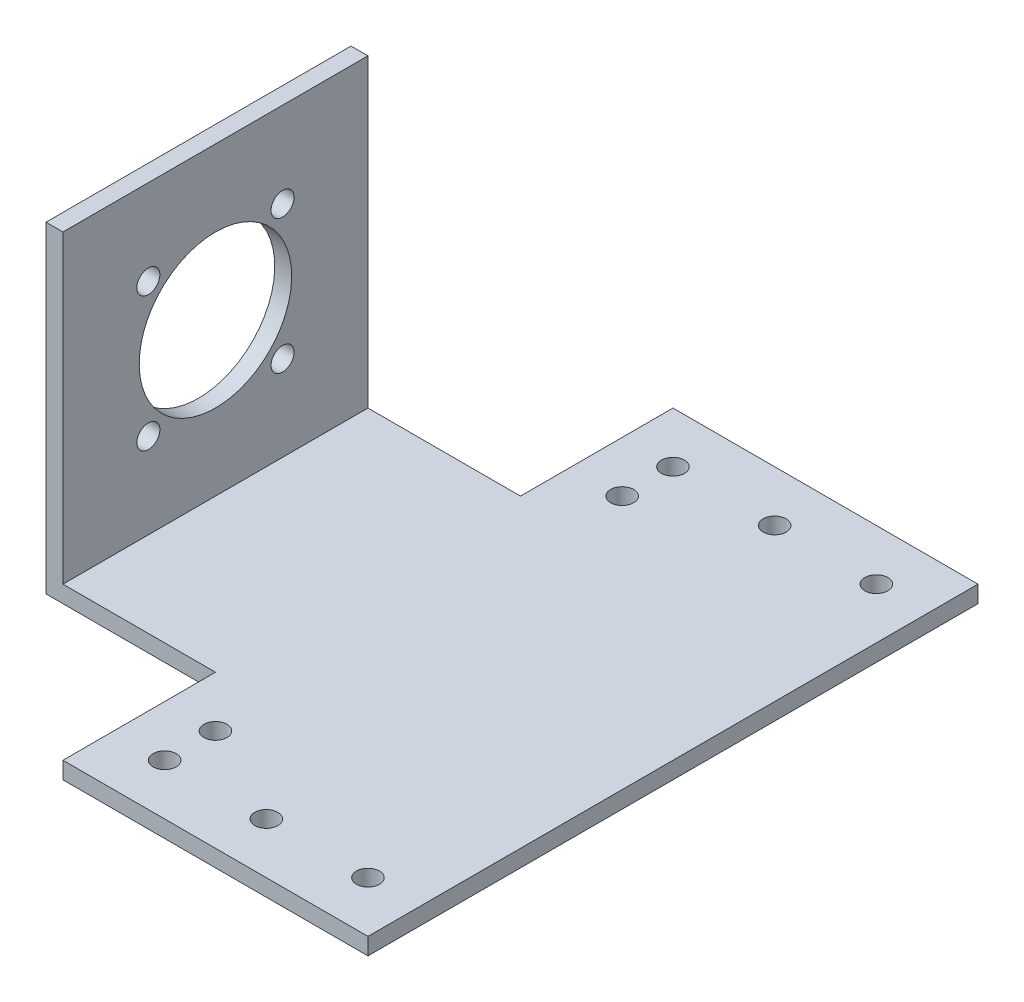
ISO-10303-21;
HEADER;
FILE_DESCRIPTION(('STEP AP214'),'2;1');
FILE_NAME('part.step','',(''),(''),'','','');
FILE_SCHEMA(('AUTOMOTIVE_DESIGN { 1 0 10303 214 1 1 1 1 }'));
ENDSEC;
DATA;
#1=APPLICATION_CONTEXT('core data for automotive mechanical design processes');
#2=APPLICATION_PROTOCOL_DEFINITION('international standard','automotive_design',2000,#1);
#3=PRODUCT_CONTEXT('',#1,'mechanical');
#4=PRODUCT('Part','Part','',(#3));
#5=PRODUCT_RELATED_PRODUCT_CATEGORY('part','',(#4));
#6=PRODUCT_DEFINITION_FORMATION('','',#4);
#7=PRODUCT_DEFINITION_CONTEXT('part definition',#1,'design');
#8=PRODUCT_DEFINITION('design','',#6,#7);
#9=PRODUCT_DEFINITION_SHAPE('','',#8);
#10=(LENGTH_UNIT() NAMED_UNIT(*) SI_UNIT(.MILLI.,.METRE.));
#11=(NAMED_UNIT(*) PLANE_ANGLE_UNIT() SI_UNIT($,.RADIAN.));
#12=(NAMED_UNIT(*) SI_UNIT($,.STERADIAN.) SOLID_ANGLE_UNIT());
#13=UNCERTAINTY_MEASURE_WITH_UNIT(LENGTH_MEASURE(1.E-05),#10,'distance_accuracy_value','');
#14=(GEOMETRIC_REPRESENTATION_CONTEXT(3) GLOBAL_UNCERTAINTY_ASSIGNED_CONTEXT((#13)) GLOBAL_UNIT_ASSIGNED_CONTEXT((#10,
#11,#12)) REPRESENTATION_CONTEXT('',''));
#15=CARTESIAN_POINT('',(0.,0.,0.));
#16=DIRECTION('',(0.,0.,1.));
#17=DIRECTION('',(1.,0.,0.));
#18=AXIS2_PLACEMENT_3D('',#15,#16,#17);
#19=CARTESIAN_POINT('',(0.,2.49999999999999,45.));
#20=DIRECTION('',(1.,0.,0.));
#21=DIRECTION('',(0.,1.,0.));
#22=AXIS2_PLACEMENT_3D('',#19,#20,#21);
#23=PLANE('',#22);
#24=DIRECTION('',(0.,1.,0.));
#25=VECTOR('',#24,1.);
#26=CARTESIAN_POINT('',(0.,2.49999999999999,22.5));
#27=LINE('',#26,#25);
#28=CARTESIAN_POINT('',(0.,0.,22.5));
#29=VERTEX_POINT('',#28);
#30=CARTESIAN_POINT('',(0.,2.49999999999999,22.5));
#31=VERTEX_POINT('',#30);
#32=EDGE_CURVE('E114',#29,#31,#27,.T.);
#33=ORIENTED_EDGE('',*,*,#32,.F.);
#34=DIRECTION('',(0.,0.,-1.));
#35=VECTOR('',#34,1.);
#36=CARTESIAN_POINT('',(0.,0.,45.));
#37=LINE('',#36,#35);
#38=CARTESIAN_POINT('',(0.,0.,45.));
#39=VERTEX_POINT('',#38);
#40=EDGE_CURVE('E11',#39,#29,#37,.T.);
#41=ORIENTED_EDGE('',*,*,#40,.F.);
#42=DIRECTION('',(0.,-1.,0.));
#43=VECTOR('',#42,1.);
#44=CARTESIAN_POINT('',(0.,2.49999999999999,45.));
#45=LINE('',#44,#43);
#46=CARTESIAN_POINT('',(0.,2.49999999999999,45.));
#47=VERTEX_POINT('',#46);
#48=EDGE_CURVE('E116',#47,#39,#45,.T.);
#49=ORIENTED_EDGE('',*,*,#48,.F.);
#50=DIRECTION('',(0.,0.,-1.));
#51=VECTOR('',#50,1.);
#52=CARTESIAN_POINT('',(0.,2.49999999999999,45.));
#53=LINE('',#52,#51);
#54=EDGE_CURVE('E110',#47,#31,#53,.T.);
#55=ORIENTED_EDGE('',*,*,#54,.T.);
#56=EDGE_LOOP('',(#33,#41,#49,#55));
#57=FACE_BOUND('',#56,.T.);
#58=ADVANCED_FACE('F35',(#57),#23,.F.);
#59=CARTESIAN_POINT('',(0.,0.,-22.5));
#60=VERTEX_POINT('',#59);
#61=CARTESIAN_POINT('',(0.,0.,-45.));
#62=VERTEX_POINT('',#61);
#63=EDGE_CURVE('E43',#60,#62,#37,.T.);
#64=ORIENTED_EDGE('',*,*,#63,.F.);
#65=DIRECTION('',(0.,1.,0.));
#66=VECTOR('',#65,1.);
#67=CARTESIAN_POINT('',(0.,2.49999999999999,-22.5));
#68=LINE('',#67,#66);
#69=CARTESIAN_POINT('',(0.,2.49999999999999,-22.5));
#70=VERTEX_POINT('',#69);
#71=EDGE_CURVE('E50',#60,#70,#68,.T.);
#72=ORIENTED_EDGE('',*,*,#71,.T.);
#73=CARTESIAN_POINT('',(0.,2.49999999999999,-45.));
#74=VERTEX_POINT('',#73);
#75=EDGE_CURVE('E120',#70,#74,#53,.T.);
#76=ORIENTED_EDGE('',*,*,#75,.T.);
#77=DIRECTION('',(0.,-1.,0.));
#78=VECTOR('',#77,1.);
#79=CARTESIAN_POINT('',(0.,2.49999999999999,-45.));
#80=LINE('',#79,#78);
#81=EDGE_CURVE('E169',#74,#62,#80,.T.);
#82=ORIENTED_EDGE('',*,*,#81,.T.);
#83=EDGE_LOOP('',(#64,#72,#76,#82));
#84=FACE_BOUND('',#83,.T.);
#85=ADVANCED_FACE('F37',(#84),#23,.F.);
#86=CARTESIAN_POINT('',(0.,0.,45.));
#87=DIRECTION('',(0.,1.,0.));
#88=DIRECTION('',(0.,0.,1.));
#89=AXIS2_PLACEMENT_3D('',#86,#87,#88);
#90=PLANE('',#89);
#91=CARTESIAN_POINT('',(7.5,0.,37.5));
#92=DIRECTION('',(0.,1.,0.));
#93=DIRECTION('',(1.,0.,0.));
#94=AXIS2_PLACEMENT_3D('',#91,#92,#93);
#95=CIRCLE('',#94,1.7);
#96=CARTESIAN_POINT('',(9.2,0.,37.5));
#97=VERTEX_POINT('',#96);
#98=EDGE_CURVE('E306',#97,#97,#95,.T.);
#99=ORIENTED_EDGE('',*,*,#98,.T.);
#100=EDGE_LOOP('',(#99));
#101=FACE_BOUND('',#100,.T.);
#102=CARTESIAN_POINT('',(22.5,0.,37.5));
#103=DIRECTION('',(0.,1.,0.));
#104=DIRECTION('',(1.,0.,0.));
#105=AXIS2_PLACEMENT_3D('',#102,#103,#104);
#106=CIRCLE('',#105,1.7);
#107=CARTESIAN_POINT('',(24.2,0.,37.5));
#108=VERTEX_POINT('',#107);
#109=EDGE_CURVE('E311',#108,#108,#106,.T.);
#110=ORIENTED_EDGE('',*,*,#109,.T.);
#111=EDGE_LOOP('',(#110));
#112=FACE_BOUND('',#111,.T.);
#113=CARTESIAN_POINT('',(37.5,0.,37.5));
#114=DIRECTION('',(0.,1.,0.));
#115=DIRECTION('',(1.,0.,0.));
#116=AXIS2_PLACEMENT_3D('',#113,#114,#115);
#117=CIRCLE('',#116,1.7);
#118=CARTESIAN_POINT('',(39.2,0.,37.5));
#119=VERTEX_POINT('',#118);
#120=EDGE_CURVE('E317',#119,#119,#117,.T.);
#121=ORIENTED_EDGE('',*,*,#120,.T.);
#122=EDGE_LOOP('',(#121));
#123=FACE_BOUND('',#122,.T.);
#124=CARTESIAN_POINT('',(22.5,0.,-37.5));
#125=DIRECTION('',(0.,1.,0.));
#126=DIRECTION('',(-1.,0.,0.));
#127=AXIS2_PLACEMENT_3D('',#124,#125,#126);
#128=CIRCLE('',#127,1.7);
#129=CARTESIAN_POINT('',(20.8,0.,-37.5));
#130=VERTEX_POINT('',#129);
#131=EDGE_CURVE('E300',#130,#130,#128,.T.);
#132=ORIENTED_EDGE('',*,*,#131,.T.);
#133=EDGE_LOOP('',(#132));
#134=FACE_BOUND('',#133,.T.);
#135=CARTESIAN_POINT('',(7.5,0.,-30.));
#136=DIRECTION('',(0.,1.,0.));
#137=DIRECTION('',(-1.,0.,0.));
#138=AXIS2_PLACEMENT_3D('',#135,#136,#137);
#139=CIRCLE('',#138,1.7);
#140=CARTESIAN_POINT('',(5.8,0.,-30.));
#141=VERTEX_POINT('',#140);
#142=EDGE_CURVE('E324',#141,#141,#139,.T.);
#143=ORIENTED_EDGE('',*,*,#142,.T.);
#144=EDGE_LOOP('',(#143));
#145=FACE_BOUND('',#144,.T.);
#146=CARTESIAN_POINT('',(37.5,0.,-37.5));
#147=DIRECTION('',(0.,1.,0.));
#148=DIRECTION('',(-1.,0.,0.));
#149=AXIS2_PLACEMENT_3D('',#146,#147,#148);
#150=CIRCLE('',#149,1.7);
#151=CARTESIAN_POINT('',(35.8,0.,-37.5));
#152=VERTEX_POINT('',#151);
#153=EDGE_CURVE('E325',#152,#152,#150,.T.);
#154=ORIENTED_EDGE('',*,*,#153,.T.);
#155=EDGE_LOOP('',(#154));
#156=FACE_BOUND('',#155,.T.);
#157=CARTESIAN_POINT('',(7.5,0.,30.));
#158=DIRECTION('',(0.,1.,0.));
#159=DIRECTION('',(1.,0.,0.));
#160=AXIS2_PLACEMENT_3D('',#157,#158,#159);
#161=CIRCLE('',#160,1.7);
#162=CARTESIAN_POINT('',(9.2,0.,30.));
#163=VERTEX_POINT('',#162);
#164=EDGE_CURVE('E335',#163,#163,#161,.T.);
#165=ORIENTED_EDGE('',*,*,#164,.T.);
#166=EDGE_LOOP('',(#165));
#167=FACE_BOUND('',#166,.T.);
#168=CARTESIAN_POINT('',(7.5,0.,-37.5));
#169=DIRECTION('',(0.,1.,0.));
#170=DIRECTION('',(-1.,0.,0.));
#171=AXIS2_PLACEMENT_3D('',#168,#169,#170);
#172=CIRCLE('',#171,1.7);
#173=CARTESIAN_POINT('',(5.8,0.,-37.5));
#174=VERTEX_POINT('',#173);
#175=EDGE_CURVE('E294',#174,#174,#172,.T.);
#176=ORIENTED_EDGE('',*,*,#175,.T.);
#177=EDGE_LOOP('',(#176));
#178=FACE_BOUND('',#177,.T.);
#179=DIRECTION('',(1.,0.,0.));
#180=VECTOR('',#179,1.);
#181=CARTESIAN_POINT('',(0.,0.,-45.));
#182=LINE('',#181,#180);
#183=CARTESIAN_POINT('',(45.,0.,-45.));
#184=VERTEX_POINT('',#183);
#185=EDGE_CURVE('E179',#62,#184,#182,.T.);
#186=ORIENTED_EDGE('',*,*,#185,.T.);
#187=DIRECTION('',(0.,0.,-1.));
#188=VECTOR('',#187,1.);
#189=CARTESIAN_POINT('',(45.,0.,45.));
#190=LINE('',#189,#188);
#191=CARTESIAN_POINT('',(45.,0.,45.));
#192=VERTEX_POINT('',#191);
#193=EDGE_CURVE('E185',#192,#184,#190,.T.);
#194=ORIENTED_EDGE('',*,*,#193,.F.);
#195=DIRECTION('',(1.,0.,0.));
#196=VECTOR('',#195,1.);
#197=CARTESIAN_POINT('',(0.,0.,45.));
#198=LINE('',#197,#196);
#199=EDGE_CURVE('E171',#39,#192,#198,.T.);
#200=ORIENTED_EDGE('',*,*,#199,.F.);
#201=ORIENTED_EDGE('',*,*,#40,.T.);
#202=DIRECTION('',(1.,0.,0.));
#203=VECTOR('',#202,1.);
#204=CARTESIAN_POINT('',(0.,0.,22.5));
#205=LINE('',#204,#203);
#206=CARTESIAN_POINT('',(-25.,0.,22.5));
#207=VERTEX_POINT('',#206);
#208=EDGE_CURVE('E135',#207,#29,#205,.T.);
#209=ORIENTED_EDGE('',*,*,#208,.F.);
#210=DIRECTION('',(0.,0.,-1.));
#211=VECTOR('',#210,1.);
#212=CARTESIAN_POINT('',(-25.,0.,22.5));
#213=LINE('',#212,#211);
#214=CARTESIAN_POINT('',(-25.,0.,-22.5));
#215=VERTEX_POINT('',#214);
#216=EDGE_CURVE('E150',#207,#215,#213,.T.);
#217=ORIENTED_EDGE('',*,*,#216,.T.);
#218=DIRECTION('',(1.,0.,0.));
#219=VECTOR('',#218,1.);
#220=CARTESIAN_POINT('',(0.,0.,-22.5));
#221=LINE('',#220,#219);
#222=EDGE_CURVE('E136',#215,#60,#221,.T.);
#223=ORIENTED_EDGE('',*,*,#222,.T.);
#224=ORIENTED_EDGE('',*,*,#63,.T.);
#225=EDGE_LOOP('',(#186,#194,#200,#201,#209,#217,#223,#224));
#226=FACE_BOUND('',#225,.T.);
#227=ADVANCED_FACE('F193',(#101,#112,#123,#134,#145,#156,#167,#178,#226),#90,.F.);
#228=CARTESIAN_POINT('',(45.,0.,45.));
#229=DIRECTION('',(-1.,0.,0.));
#230=DIRECTION('',(0.,0.,1.));
#231=AXIS2_PLACEMENT_3D('',#228,#229,#230);
#232=PLANE('',#231);
#233=DIRECTION('',(0.,1.,0.));
#234=VECTOR('',#233,1.);
#235=CARTESIAN_POINT('',(45.,0.,-45.));
#236=LINE('',#235,#234);
#237=CARTESIAN_POINT('',(45.,2.5,-45.));
#238=VERTEX_POINT('',#237);
#239=EDGE_CURVE('E181',#184,#238,#236,.T.);
#240=ORIENTED_EDGE('',*,*,#239,.T.);
#241=DIRECTION('',(0.,0.,-1.));
#242=VECTOR('',#241,1.);
#243=CARTESIAN_POINT('',(45.,2.5,45.));
#244=LINE('',#243,#242);
#245=CARTESIAN_POINT('',(45.,2.5,45.));
#246=VERTEX_POINT('',#245);
#247=EDGE_CURVE('E119',#246,#238,#244,.T.);
#248=ORIENTED_EDGE('',*,*,#247,.F.);
#249=DIRECTION('',(0.,1.,0.));
#250=VECTOR('',#249,1.);
#251=CARTESIAN_POINT('',(45.,0.,45.));
#252=LINE('',#251,#250);
#253=EDGE_CURVE('E174',#192,#246,#252,.T.);
#254=ORIENTED_EDGE('',*,*,#253,.F.);
#255=ORIENTED_EDGE('',*,*,#193,.T.);
#256=EDGE_LOOP('',(#240,#248,#254,#255));
#257=FACE_BOUND('',#256,.T.);
#258=ADVANCED_FACE('F201',(#257),#232,.F.);
#259=CARTESIAN_POINT('',(45.,2.5,45.));
#260=DIRECTION('',(0.,-1.,0.));
#261=DIRECTION('',(1.,0.,0.));
#262=AXIS2_PLACEMENT_3D('',#259,#260,#261);
#263=PLANE('',#262);
#264=CARTESIAN_POINT('',(7.5,2.49999999999999,37.5));
#265=DIRECTION('',(0.,1.,0.));
#266=DIRECTION('',(1.,0.,0.));
#267=AXIS2_PLACEMENT_3D('',#264,#265,#266);
#268=CIRCLE('',#267,1.7);
#269=CARTESIAN_POINT('',(9.2,2.5,37.5));
#270=VERTEX_POINT('',#269);
#271=EDGE_CURVE('E303',#270,#270,#268,.T.);
#272=ORIENTED_EDGE('',*,*,#271,.F.);
#273=EDGE_LOOP('',(#272));
#274=FACE_BOUND('',#273,.T.);
#275=CARTESIAN_POINT('',(22.5,2.5,37.5));
#276=DIRECTION('',(0.,1.,0.));
#277=DIRECTION('',(1.,0.,0.));
#278=AXIS2_PLACEMENT_3D('',#275,#276,#277);
#279=CIRCLE('',#278,1.7);
#280=CARTESIAN_POINT('',(24.2,2.5,37.5));
#281=VERTEX_POINT('',#280);
#282=EDGE_CURVE('E308',#281,#281,#279,.T.);
#283=ORIENTED_EDGE('',*,*,#282,.F.);
#284=EDGE_LOOP('',(#283));
#285=FACE_BOUND('',#284,.T.);
#286=CARTESIAN_POINT('',(37.5,2.5,37.5));
#287=DIRECTION('',(0.,1.,0.));
#288=DIRECTION('',(1.,0.,0.));
#289=AXIS2_PLACEMENT_3D('',#286,#287,#288);
#290=CIRCLE('',#289,1.7);
#291=CARTESIAN_POINT('',(39.2,2.5,37.5));
#292=VERTEX_POINT('',#291);
#293=EDGE_CURVE('E314',#292,#292,#290,.T.);
#294=ORIENTED_EDGE('',*,*,#293,.F.);
#295=EDGE_LOOP('',(#294));
#296=FACE_BOUND('',#295,.T.);
#297=CARTESIAN_POINT('',(22.5,2.5,-37.5));
#298=DIRECTION('',(0.,1.,0.));
#299=DIRECTION('',(-1.,0.,0.));
#300=AXIS2_PLACEMENT_3D('',#297,#298,#299);
#301=CIRCLE('',#300,1.7);
#302=CARTESIAN_POINT('',(20.8,2.5,-37.5));
#303=VERTEX_POINT('',#302);
#304=EDGE_CURVE('E328',#303,#303,#301,.T.);
#305=ORIENTED_EDGE('',*,*,#304,.F.);
#306=EDGE_LOOP('',(#305));
#307=FACE_BOUND('',#306,.T.);
#308=CARTESIAN_POINT('',(7.5,2.49999999999999,-30.));
#309=DIRECTION('',(0.,1.,0.));
#310=DIRECTION('',(-1.,0.,0.));
#311=AXIS2_PLACEMENT_3D('',#308,#309,#310);
#312=CIRCLE('',#311,1.7);
#313=CARTESIAN_POINT('',(5.8,2.49999999999999,-30.));
#314=VERTEX_POINT('',#313);
#315=EDGE_CURVE('E321',#314,#314,#312,.T.);
#316=ORIENTED_EDGE('',*,*,#315,.F.);
#317=EDGE_LOOP('',(#316));
#318=FACE_BOUND('',#317,.T.);
#319=CARTESIAN_POINT('',(37.5,2.5,-37.5));
#320=DIRECTION('',(0.,1.,0.));
#321=DIRECTION('',(-1.,0.,0.));
#322=AXIS2_PLACEMENT_3D('',#319,#320,#321);
#323=CIRCLE('',#322,1.7);
#324=CARTESIAN_POINT('',(35.8,2.5,-37.5));
#325=VERTEX_POINT('',#324);
#326=EDGE_CURVE('E338',#325,#325,#323,.T.);
#327=ORIENTED_EDGE('',*,*,#326,.F.);
#328=EDGE_LOOP('',(#327));
#329=FACE_BOUND('',#328,.T.);
#330=CARTESIAN_POINT('',(7.5,2.49999999999999,30.));
#331=DIRECTION('',(0.,1.,0.));
#332=DIRECTION('',(1.,0.,0.));
#333=AXIS2_PLACEMENT_3D('',#330,#331,#332);
#334=CIRCLE('',#333,1.7);
#335=CARTESIAN_POINT('',(9.2,2.5,30.));
#336=VERTEX_POINT('',#335);
#337=EDGE_CURVE('E320',#336,#336,#334,.T.);
#338=ORIENTED_EDGE('',*,*,#337,.F.);
#339=EDGE_LOOP('',(#338));
#340=FACE_BOUND('',#339,.T.);
#341=CARTESIAN_POINT('',(7.5,2.49999999999999,-37.5));
#342=DIRECTION('',(0.,1.,0.));
#343=DIRECTION('',(-1.,0.,0.));
#344=AXIS2_PLACEMENT_3D('',#341,#342,#343);
#345=CIRCLE('',#344,1.7);
#346=CARTESIAN_POINT('',(5.8,2.49999999999999,-37.5));
#347=VERTEX_POINT('',#346);
#348=EDGE_CURVE('E297',#347,#347,#345,.T.);
#349=ORIENTED_EDGE('',*,*,#348,.F.);
#350=EDGE_LOOP('',(#349));
#351=FACE_BOUND('',#350,.T.);
#352=DIRECTION('',(-1.,0.,0.));
#353=VECTOR('',#352,1.);
#354=CARTESIAN_POINT('',(45.,2.5,-45.));
#355=LINE('',#354,#353);
#356=EDGE_CURVE('E172',#238,#74,#355,.T.);
#357=ORIENTED_EDGE('',*,*,#356,.T.);
#358=ORIENTED_EDGE('',*,*,#75,.F.);
#359=DIRECTION('',(-1.,0.,0.));
#360=VECTOR('',#359,1.);
#361=CARTESIAN_POINT('',(-22.5,2.49999999999999,-22.5));
#362=LINE('',#361,#360);
#363=CARTESIAN_POINT('',(-22.5,2.49999999999999,-22.5));
#364=VERTEX_POINT('',#363);
#365=EDGE_CURVE('E152',#70,#364,#362,.T.);
#366=ORIENTED_EDGE('',*,*,#365,.T.);
#367=DIRECTION('',(0.,0.,-1.));
#368=VECTOR('',#367,1.);
#369=CARTESIAN_POINT('',(-22.5,2.49999999999999,22.5));
#370=LINE('',#369,#368);
#371=CARTESIAN_POINT('',(-22.5,2.49999999999999,22.5));
#372=VERTEX_POINT('',#371);
#373=EDGE_CURVE('E127',#372,#364,#370,.T.);
#374=ORIENTED_EDGE('',*,*,#373,.F.);
#375=DIRECTION('',(-1.,0.,0.));
#376=VECTOR('',#375,1.);
#377=CARTESIAN_POINT('',(-22.5,2.49999999999999,22.5));
#378=LINE('',#377,#376);
#379=EDGE_CURVE('E123',#31,#372,#378,.T.);
#380=ORIENTED_EDGE('',*,*,#379,.F.);
#381=ORIENTED_EDGE('',*,*,#54,.F.);
#382=DIRECTION('',(-1.,0.,0.));
#383=VECTOR('',#382,1.);
#384=CARTESIAN_POINT('',(45.,2.5,45.));
#385=LINE('',#384,#383);
#386=EDGE_CURVE('E176',#246,#47,#385,.T.);
#387=ORIENTED_EDGE('',*,*,#386,.F.);
#388=ORIENTED_EDGE('',*,*,#247,.T.);
#389=EDGE_LOOP('',(#357,#358,#366,#374,#380,#381,#387,#388));
#390=FACE_BOUND('',#389,.T.);
#391=ADVANCED_FACE('F125',(#274,#285,#296,#307,#318,#329,#340,#351,#390),#263,.F.);
#392=CARTESIAN_POINT('',(0.,0.,45.));
#393=DIRECTION('',(0.,0.,1.));
#394=DIRECTION('',(1.,0.,0.));
#395=AXIS2_PLACEMENT_3D('',#392,#393,#394);
#396=PLANE('',#395);
#397=ORIENTED_EDGE('',*,*,#48,.T.);
#398=ORIENTED_EDGE('',*,*,#199,.T.);
#399=ORIENTED_EDGE('',*,*,#253,.T.);
#400=ORIENTED_EDGE('',*,*,#386,.T.);
#401=EDGE_LOOP('',(#397,#398,#399,#400));
#402=FACE_BOUND('',#401,.T.);
#403=ADVANCED_FACE('F203',(#402),#396,.T.);
#404=CARTESIAN_POINT('',(0.,0.,-45.));
#405=DIRECTION('',(0.,0.,1.));
#406=DIRECTION('',(1.,0.,0.));
#407=AXIS2_PLACEMENT_3D('',#404,#405,#406);
#408=PLANE('',#407);
#409=ORIENTED_EDGE('',*,*,#81,.F.);
#410=ORIENTED_EDGE('',*,*,#356,.F.);
#411=ORIENTED_EDGE('',*,*,#239,.F.);
#412=ORIENTED_EDGE('',*,*,#185,.F.);
#413=EDGE_LOOP('',(#409,#410,#411,#412));
#414=FACE_BOUND('',#413,.T.);
#415=ADVANCED_FACE('F197',(#414),#408,.F.);
#416=CARTESIAN_POINT('',(-22.5,47.5,22.5));
#417=DIRECTION('',(-1.,0.,0.));
#418=DIRECTION('',(0.,-1.,0.));
#419=AXIS2_PLACEMENT_3D('',#416,#417,#418);
#420=PLANE('',#419);
#421=CARTESIAN_POINT('',(-22.5,34.8994949366116,-9.89949493661167));
#422=DIRECTION('',(1.,0.,0.));
#423=DIRECTION('',(0.,-1.,0.));
#424=AXIS2_PLACEMENT_3D('',#421,#422,#423);
#425=CIRCLE('',#424,1.7);
#426=CARTESIAN_POINT('',(-22.5,33.1994949366116,-9.89949493661167));
#427=VERTEX_POINT('',#426);
#428=EDGE_CURVE('E261',#427,#427,#425,.T.);
#429=ORIENTED_EDGE('',*,*,#428,.F.);
#430=EDGE_LOOP('',(#429));
#431=FACE_BOUND('',#430,.T.);
#432=CARTESIAN_POINT('',(-22.5,15.1005050633883,9.89949493661165));
#433=DIRECTION('',(1.,0.,0.));
#434=DIRECTION('',(0.,-1.,0.));
#435=AXIS2_PLACEMENT_3D('',#432,#433,#434);
#436=CIRCLE('',#435,1.69999999999999);
#437=CARTESIAN_POINT('',(-22.5,13.4005050633883,9.89949493661165));
#438=VERTEX_POINT('',#437);
#439=EDGE_CURVE('E265',#438,#438,#436,.T.);
#440=ORIENTED_EDGE('',*,*,#439,.F.);
#441=EDGE_LOOP('',(#440));
#442=FACE_BOUND('',#441,.T.);
#443=CARTESIAN_POINT('',(-22.5,15.1005050633883,-9.89949493661167));
#444=DIRECTION('',(1.,0.,0.));
#445=DIRECTION('',(0.,1.,0.));
#446=AXIS2_PLACEMENT_3D('',#443,#444,#445);
#447=CIRCLE('',#446,1.7);
#448=CARTESIAN_POINT('',(-22.5,16.8005050633883,-9.89949493661167));
#449=VERTEX_POINT('',#448);
#450=EDGE_CURVE('E269',#449,#449,#447,.T.);
#451=ORIENTED_EDGE('',*,*,#450,.F.);
#452=EDGE_LOOP('',(#451));
#453=FACE_BOUND('',#452,.T.);
#454=CARTESIAN_POINT('',(-22.5,34.8994949366116,9.89949493661168));
#455=DIRECTION('',(1.,0.,0.));
#456=DIRECTION('',(0.,1.,0.));
#457=AXIS2_PLACEMENT_3D('',#454,#455,#456);
#458=CIRCLE('',#457,1.7);
#459=CARTESIAN_POINT('',(-22.5,36.5994949366116,9.89949493661168));
#460=VERTEX_POINT('',#459);
#461=EDGE_CURVE('E273',#460,#460,#458,.T.);
#462=ORIENTED_EDGE('',*,*,#461,.F.);
#463=EDGE_LOOP('',(#462));
#464=FACE_BOUND('',#463,.T.);
#465=CARTESIAN_POINT('',(-22.5,25.,0.));
#466=DIRECTION('',(1.,0.,0.));
#467=DIRECTION('',(0.,1.,0.));
#468=AXIS2_PLACEMENT_3D('',#465,#466,#467);
#469=CIRCLE('',#468,11.25);
#470=CARTESIAN_POINT('',(-22.5,36.25,0.));
#471=VERTEX_POINT('',#470);
#472=EDGE_CURVE('E141',#471,#471,#469,.T.);
#473=ORIENTED_EDGE('',*,*,#472,.F.);
#474=EDGE_LOOP('',(#473));
#475=FACE_BOUND('',#474,.T.);
#476=DIRECTION('',(0.,1.,0.));
#477=VECTOR('',#476,1.);
#478=CARTESIAN_POINT('',(-22.5,47.5,-22.5));
#479=LINE('',#478,#477);
#480=CARTESIAN_POINT('',(-22.5,47.5,-22.5));
#481=VERTEX_POINT('',#480);
#482=EDGE_CURVE('E155',#364,#481,#479,.T.);
#483=ORIENTED_EDGE('',*,*,#482,.T.);
#484=DIRECTION('',(0.,0.,-1.));
#485=VECTOR('',#484,1.);
#486=CARTESIAN_POINT('',(-22.5,47.5,22.5));
#487=LINE('',#486,#485);
#488=CARTESIAN_POINT('',(-22.5,47.5,22.5));
#489=VERTEX_POINT('',#488);
#490=EDGE_CURVE('E165',#489,#481,#487,.T.);
#491=ORIENTED_EDGE('',*,*,#490,.F.);
#492=DIRECTION('',(0.,1.,0.));
#493=VECTOR('',#492,1.);
#494=CARTESIAN_POINT('',(-22.5,47.5,22.5));
#495=LINE('',#494,#493);
#496=EDGE_CURVE('E130',#372,#489,#495,.T.);
#497=ORIENTED_EDGE('',*,*,#496,.F.);
#498=ORIENTED_EDGE('',*,*,#373,.T.);
#499=EDGE_LOOP('',(#483,#491,#497,#498));
#500=FACE_BOUND('',#499,.T.);
#501=ADVANCED_FACE('F213',(#431,#442,#453,#464,#475,#500),#420,.F.);
#502=CARTESIAN_POINT('',(-25.,47.5,22.5));
#503=DIRECTION('',(0.,-1.,0.));
#504=DIRECTION('',(0.,0.,-1.));
#505=AXIS2_PLACEMENT_3D('',#502,#503,#504);
#506=PLANE('',#505);
#507=DIRECTION('',(-1.,0.,0.));
#508=VECTOR('',#507,1.);
#509=CARTESIAN_POINT('',(-25.,47.5,-22.5));
#510=LINE('',#509,#508);
#511=CARTESIAN_POINT('',(-25.,47.5,-22.5));
#512=VERTEX_POINT('',#511);
#513=EDGE_CURVE('E157',#481,#512,#510,.T.);
#514=ORIENTED_EDGE('',*,*,#513,.T.);
#515=DIRECTION('',(0.,0.,-1.));
#516=VECTOR('',#515,1.);
#517=CARTESIAN_POINT('',(-25.,47.5,22.5));
#518=LINE('',#517,#516);
#519=CARTESIAN_POINT('',(-25.,47.5,22.5));
#520=VERTEX_POINT('',#519);
#521=EDGE_CURVE('E162',#520,#512,#518,.T.);
#522=ORIENTED_EDGE('',*,*,#521,.F.);
#523=DIRECTION('',(-1.,0.,0.));
#524=VECTOR('',#523,1.);
#525=CARTESIAN_POINT('',(-25.,47.5,22.5));
#526=LINE('',#525,#524);
#527=EDGE_CURVE('E145',#489,#520,#526,.T.);
#528=ORIENTED_EDGE('',*,*,#527,.F.);
#529=ORIENTED_EDGE('',*,*,#490,.T.);
#530=EDGE_LOOP('',(#514,#522,#528,#529));
#531=FACE_BOUND('',#530,.T.);
#532=ADVANCED_FACE('F218',(#531),#506,.F.);
#533=CARTESIAN_POINT('',(-25.,0.,22.5));
#534=DIRECTION('',(1.,0.,0.));
#535=DIRECTION('',(0.,0.,-1.));
#536=AXIS2_PLACEMENT_3D('',#533,#534,#535);
#537=PLANE('',#536);
#538=CARTESIAN_POINT('',(-25.,34.8994949366116,-9.89949493661167));
#539=DIRECTION('',(1.,0.,0.));
#540=DIRECTION('',(0.,-1.,0.));
#541=AXIS2_PLACEMENT_3D('',#538,#539,#540);
#542=CIRCLE('',#541,1.7);
#543=CARTESIAN_POINT('',(-25.,33.1994949366116,-9.89949493661167));
#544=VERTEX_POINT('',#543);
#545=EDGE_CURVE('E283',#544,#544,#542,.T.);
#546=ORIENTED_EDGE('',*,*,#545,.T.);
#547=EDGE_LOOP('',(#546));
#548=FACE_BOUND('',#547,.T.);
#549=CARTESIAN_POINT('',(-25.,15.1005050633883,9.89949493661165));
#550=DIRECTION('',(1.,0.,0.));
#551=DIRECTION('',(0.,-1.,0.));
#552=AXIS2_PLACEMENT_3D('',#549,#550,#551);
#553=CIRCLE('',#552,1.69999999999999);
#554=CARTESIAN_POINT('',(-25.,13.4005050633883,9.89949493661165));
#555=VERTEX_POINT('',#554);
#556=EDGE_CURVE('E287',#555,#555,#553,.T.);
#557=ORIENTED_EDGE('',*,*,#556,.T.);
#558=EDGE_LOOP('',(#557));
#559=FACE_BOUND('',#558,.T.);
#560=CARTESIAN_POINT('',(-25.,15.1005050633883,-9.89949493661167));
#561=DIRECTION('',(1.,0.,0.));
#562=DIRECTION('',(0.,1.,0.));
#563=AXIS2_PLACEMENT_3D('',#560,#561,#562);
#564=CIRCLE('',#563,1.7);
#565=CARTESIAN_POINT('',(-25.,16.8005050633883,-9.89949493661167));
#566=VERTEX_POINT('',#565);
#567=EDGE_CURVE('E288',#566,#566,#564,.T.);
#568=ORIENTED_EDGE('',*,*,#567,.T.);
#569=EDGE_LOOP('',(#568));
#570=FACE_BOUND('',#569,.T.);
#571=CARTESIAN_POINT('',(-25.,34.8994949366116,9.89949493661168));
#572=DIRECTION('',(1.,0.,0.));
#573=DIRECTION('',(0.,1.,0.));
#574=AXIS2_PLACEMENT_3D('',#571,#572,#573);
#575=CIRCLE('',#574,1.7);
#576=CARTESIAN_POINT('',(-25.,36.5994949366116,9.89949493661168));
#577=VERTEX_POINT('',#576);
#578=EDGE_CURVE('E277',#577,#577,#575,.T.);
#579=ORIENTED_EDGE('',*,*,#578,.T.);
#580=EDGE_LOOP('',(#579));
#581=FACE_BOUND('',#580,.T.);
#582=CARTESIAN_POINT('',(-25.,25.,0.));
#583=DIRECTION('',(1.,0.,0.));
#584=DIRECTION('',(0.,1.,0.));
#585=AXIS2_PLACEMENT_3D('',#582,#583,#584);
#586=CIRCLE('',#585,11.25);
#587=CARTESIAN_POINT('',(-25.,36.25,0.));
#588=VERTEX_POINT('',#587);
#589=EDGE_CURVE('E153',#588,#588,#586,.T.);
#590=ORIENTED_EDGE('',*,*,#589,.T.);
#591=EDGE_LOOP('',(#590));
#592=FACE_BOUND('',#591,.T.);
#593=DIRECTION('',(0.,-1.,0.));
#594=VECTOR('',#593,1.);
#595=CARTESIAN_POINT('',(-25.,0.,-22.5));
#596=LINE('',#595,#594);
#597=EDGE_CURVE('E138',#512,#215,#596,.T.);
#598=ORIENTED_EDGE('',*,*,#597,.T.);
#599=ORIENTED_EDGE('',*,*,#216,.F.);
#600=DIRECTION('',(0.,-1.,0.));
#601=VECTOR('',#600,1.);
#602=CARTESIAN_POINT('',(-25.,0.,22.5));
#603=LINE('',#602,#601);
#604=EDGE_CURVE('E147',#520,#207,#603,.T.);
#605=ORIENTED_EDGE('',*,*,#604,.F.);
#606=ORIENTED_EDGE('',*,*,#521,.T.);
#607=EDGE_LOOP('',(#598,#599,#605,#606));
#608=FACE_BOUND('',#607,.T.);
#609=ADVANCED_FACE('F219',(#548,#559,#570,#581,#592,#608),#537,.F.);
#610=CARTESIAN_POINT('',(0.,0.,22.5));
#611=DIRECTION('',(0.,0.,-1.));
#612=DIRECTION('',(-1.,0.,0.));
#613=AXIS2_PLACEMENT_3D('',#610,#611,#612);
#614=PLANE('',#613);
#615=ORIENTED_EDGE('',*,*,#32,.T.);
#616=ORIENTED_EDGE('',*,*,#379,.T.);
#617=ORIENTED_EDGE('',*,*,#496,.T.);
#618=ORIENTED_EDGE('',*,*,#527,.T.);
#619=ORIENTED_EDGE('',*,*,#604,.T.);
#620=ORIENTED_EDGE('',*,*,#208,.T.);
#621=EDGE_LOOP('',(#615,#616,#617,#618,#619,#620));
#622=FACE_BOUND('',#621,.T.);
#623=ADVANCED_FACE('F133',(#622),#614,.F.);
#624=CARTESIAN_POINT('',(0.,0.,-22.5));
#625=DIRECTION('',(0.,0.,-1.));
#626=DIRECTION('',(-1.,0.,0.));
#627=AXIS2_PLACEMENT_3D('',#624,#625,#626);
#628=PLANE('',#627);
#629=ORIENTED_EDGE('',*,*,#71,.F.);
#630=ORIENTED_EDGE('',*,*,#222,.F.);
#631=ORIENTED_EDGE('',*,*,#597,.F.);
#632=ORIENTED_EDGE('',*,*,#513,.F.);
#633=ORIENTED_EDGE('',*,*,#482,.F.);
#634=ORIENTED_EDGE('',*,*,#365,.F.);
#635=EDGE_LOOP('',(#629,#630,#631,#632,#633,#634));
#636=FACE_BOUND('',#635,.T.);
#637=ADVANCED_FACE('F209',(#636),#628,.T.);
#638=CARTESIAN_POINT('',(-25.,25.,0.));
#639=DIRECTION('',(1.,0.,0.));
#640=DIRECTION('',(0.,1.,0.));
#641=AXIS2_PLACEMENT_3D('',#638,#639,#640);
#642=CYLINDRICAL_SURFACE('',#641,11.25);
#643=ORIENTED_EDGE('',*,*,#589,.F.);
#644=EDGE_LOOP('',(#643));
#645=FACE_BOUND('',#644,.T.);
#646=ORIENTED_EDGE('',*,*,#472,.T.);
#647=EDGE_LOOP('',(#646));
#648=FACE_BOUND('',#647,.T.);
#649=ADVANCED_FACE('F388',(#645,#648),#642,.F.);
#650=CARTESIAN_POINT('',(-25.,34.8994949366116,9.89949493661168));
#651=DIRECTION('',(1.,0.,0.));
#652=DIRECTION('',(0.,1.,0.));
#653=AXIS2_PLACEMENT_3D('',#650,#651,#652);
#654=CYLINDRICAL_SURFACE('',#653,1.7);
#655=ORIENTED_EDGE('',*,*,#578,.F.);
#656=EDGE_LOOP('',(#655));
#657=FACE_BOUND('',#656,.T.);
#658=ORIENTED_EDGE('',*,*,#461,.T.);
#659=EDGE_LOOP('',(#658));
#660=FACE_BOUND('',#659,.T.);
#661=ADVANCED_FACE('F380',(#657,#660),#654,.F.);
#662=CARTESIAN_POINT('',(-25.,15.1005050633883,-9.89949493661167));
#663=DIRECTION('',(1.,0.,0.));
#664=DIRECTION('',(0.,1.,0.));
#665=AXIS2_PLACEMENT_3D('',#662,#663,#664);
#666=CYLINDRICAL_SURFACE('',#665,1.7);
#667=ORIENTED_EDGE('',*,*,#567,.F.);
#668=EDGE_LOOP('',(#667));
#669=FACE_BOUND('',#668,.T.);
#670=ORIENTED_EDGE('',*,*,#450,.T.);
#671=EDGE_LOOP('',(#670));
#672=FACE_BOUND('',#671,.T.);
#673=ADVANCED_FACE('F378',(#669,#672),#666,.F.);
#674=CARTESIAN_POINT('',(-25.,15.1005050633883,9.89949493661165));
#675=DIRECTION('',(1.,0.,0.));
#676=DIRECTION('',(0.,1.,0.));
#677=AXIS2_PLACEMENT_3D('',#674,#675,#676);
#678=CYLINDRICAL_SURFACE('',#677,1.69999999999999);
#679=ORIENTED_EDGE('',*,*,#556,.F.);
#680=EDGE_LOOP('',(#679));
#681=FACE_BOUND('',#680,.T.);
#682=ORIENTED_EDGE('',*,*,#439,.T.);
#683=EDGE_LOOP('',(#682));
#684=FACE_BOUND('',#683,.T.);
#685=ADVANCED_FACE('F370',(#681,#684),#678,.F.);
#686=CARTESIAN_POINT('',(-25.,34.8994949366116,-9.89949493661167));
#687=DIRECTION('',(1.,0.,0.));
#688=DIRECTION('',(0.,1.,0.));
#689=AXIS2_PLACEMENT_3D('',#686,#687,#688);
#690=CYLINDRICAL_SURFACE('',#689,1.7);
#691=ORIENTED_EDGE('',*,*,#545,.F.);
#692=EDGE_LOOP('',(#691));
#693=FACE_BOUND('',#692,.T.);
#694=ORIENTED_EDGE('',*,*,#428,.T.);
#695=EDGE_LOOP('',(#694));
#696=FACE_BOUND('',#695,.T.);
#697=ADVANCED_FACE('F361',(#693,#696),#690,.F.);
#698=CARTESIAN_POINT('',(7.5,0.,-37.5));
#699=DIRECTION('',(0.,1.,0.));
#700=DIRECTION('',(-1.,0.,0.));
#701=AXIS2_PLACEMENT_3D('',#698,#699,#700);
#702=CYLINDRICAL_SURFACE('',#701,1.7);
#703=ORIENTED_EDGE('',*,*,#175,.F.);
#704=EDGE_LOOP('',(#703));
#705=FACE_BOUND('',#704,.T.);
#706=ORIENTED_EDGE('',*,*,#348,.T.);
#707=EDGE_LOOP('',(#706));
#708=FACE_BOUND('',#707,.T.);
#709=ADVANCED_FACE('F359',(#705,#708),#702,.F.);
#710=CARTESIAN_POINT('',(7.5,0.,30.));
#711=DIRECTION('',(0.,1.,0.));
#712=DIRECTION('',(-1.,0.,0.));
#713=AXIS2_PLACEMENT_3D('',#710,#711,#712);
#714=CYLINDRICAL_SURFACE('',#713,1.7);
#715=ORIENTED_EDGE('',*,*,#164,.F.);
#716=EDGE_LOOP('',(#715));
#717=FACE_BOUND('',#716,.T.);
#718=ORIENTED_EDGE('',*,*,#337,.T.);
#719=EDGE_LOOP('',(#718));
#720=FACE_BOUND('',#719,.T.);
#721=ADVANCED_FACE('F350',(#717,#720),#714,.F.);
#722=CARTESIAN_POINT('',(37.5,0.,-37.5));
#723=DIRECTION('',(0.,1.,0.));
#724=DIRECTION('',(-1.,0.,0.));
#725=AXIS2_PLACEMENT_3D('',#722,#723,#724);
#726=CYLINDRICAL_SURFACE('',#725,1.7);
#727=ORIENTED_EDGE('',*,*,#153,.F.);
#728=EDGE_LOOP('',(#727));
#729=FACE_BOUND('',#728,.T.);
#730=ORIENTED_EDGE('',*,*,#326,.T.);
#731=EDGE_LOOP('',(#730));
#732=FACE_BOUND('',#731,.T.);
#733=ADVANCED_FACE('F346',(#729,#732),#726,.F.);
#734=CARTESIAN_POINT('',(7.5,0.,-30.));
#735=DIRECTION('',(0.,1.,0.));
#736=DIRECTION('',(-1.,0.,0.));
#737=AXIS2_PLACEMENT_3D('',#734,#735,#736);
#738=CYLINDRICAL_SURFACE('',#737,1.7);
#739=ORIENTED_EDGE('',*,*,#142,.F.);
#740=EDGE_LOOP('',(#739));
#741=FACE_BOUND('',#740,.T.);
#742=ORIENTED_EDGE('',*,*,#315,.T.);
#743=EDGE_LOOP('',(#742));
#744=FACE_BOUND('',#743,.T.);
#745=ADVANCED_FACE('F349',(#741,#744),#738,.F.);
#746=CARTESIAN_POINT('',(22.5,0.,-37.5));
#747=DIRECTION('',(0.,1.,0.));
#748=DIRECTION('',(-1.,0.,0.));
#749=AXIS2_PLACEMENT_3D('',#746,#747,#748);
#750=CYLINDRICAL_SURFACE('',#749,1.7);
#751=ORIENTED_EDGE('',*,*,#131,.F.);
#752=EDGE_LOOP('',(#751));
#753=FACE_BOUND('',#752,.T.);
#754=ORIENTED_EDGE('',*,*,#304,.T.);
#755=EDGE_LOOP('',(#754));
#756=FACE_BOUND('',#755,.T.);
#757=ADVANCED_FACE('F456',(#753,#756),#750,.F.);
#758=CARTESIAN_POINT('',(37.5,0.,37.5));
#759=DIRECTION('',(0.,1.,0.));
#760=DIRECTION('',(-1.,0.,0.));
#761=AXIS2_PLACEMENT_3D('',#758,#759,#760);
#762=CYLINDRICAL_SURFACE('',#761,1.7);
#763=ORIENTED_EDGE('',*,*,#120,.F.);
#764=EDGE_LOOP('',(#763));
#765=FACE_BOUND('',#764,.T.);
#766=ORIENTED_EDGE('',*,*,#293,.T.);
#767=EDGE_LOOP('',(#766));
#768=FACE_BOUND('',#767,.T.);
#769=ADVANCED_FACE('F466',(#765,#768),#762,.F.);
#770=CARTESIAN_POINT('',(22.5,0.,37.5));
#771=DIRECTION('',(0.,1.,0.));
#772=DIRECTION('',(-1.,0.,0.));
#773=AXIS2_PLACEMENT_3D('',#770,#771,#772);
#774=CYLINDRICAL_SURFACE('',#773,1.7);
#775=ORIENTED_EDGE('',*,*,#109,.F.);
#776=EDGE_LOOP('',(#775));
#777=FACE_BOUND('',#776,.T.);
#778=ORIENTED_EDGE('',*,*,#282,.T.);
#779=EDGE_LOOP('',(#778));
#780=FACE_BOUND('',#779,.T.);
#781=ADVANCED_FACE('F476',(#777,#780),#774,.F.);
#782=CARTESIAN_POINT('',(7.5,0.,37.5));
#783=DIRECTION('',(0.,1.,0.));
#784=DIRECTION('',(-1.,0.,0.));
#785=AXIS2_PLACEMENT_3D('',#782,#783,#784);
#786=CYLINDRICAL_SURFACE('',#785,1.7);
#787=ORIENTED_EDGE('',*,*,#98,.F.);
#788=EDGE_LOOP('',(#787));
#789=FACE_BOUND('',#788,.T.);
#790=ORIENTED_EDGE('',*,*,#271,.T.);
#791=EDGE_LOOP('',(#790));
#792=FACE_BOUND('',#791,.T.);
#793=ADVANCED_FACE('F376',(#789,#792),#786,.F.);
#794=CLOSED_SHELL('',(#58,#85,#227,#258,#391,#403,#415,#501,#532,#609,#623,#637,#649,#661,#673,
#685,#697,#709,#721,#733,#745,#757,#769,#781,#793));
#795=MANIFOLD_SOLID_BREP('B2',#794);
#796=ADVANCED_BREP_SHAPE_REPRESENTATION('',(#18,#795),#14);
#797=SHAPE_DEFINITION_REPRESENTATION(#9,#796);
ENDSEC;
END-ISO-10303-21;
